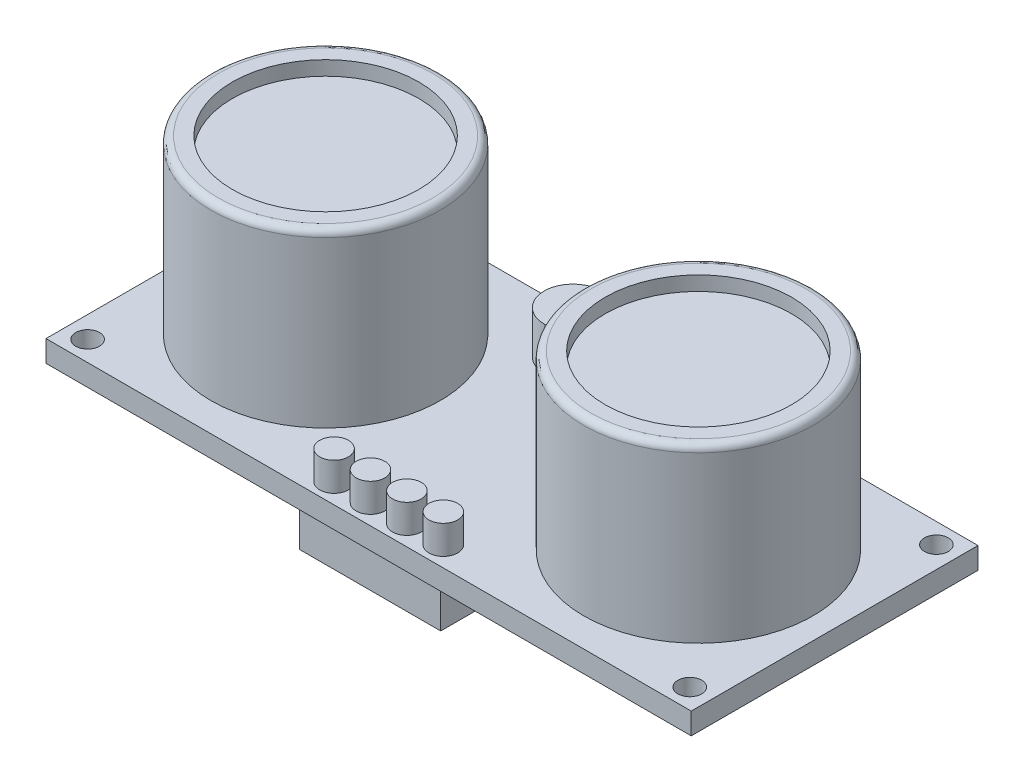
ISO-10303-21;
HEADER;
FILE_DESCRIPTION(('STEP AP214'),'2;1');
FILE_NAME('part.step','',(''),(''),'','','');
FILE_SCHEMA(('AUTOMOTIVE_DESIGN { 1 0 10303 214 1 1 1 1 }'));
ENDSEC;
DATA;
#1=APPLICATION_CONTEXT('core data for automotive mechanical design processes');
#2=APPLICATION_PROTOCOL_DEFINITION('international standard','automotive_design',2000,#1);
#3=PRODUCT_CONTEXT('',#1,'mechanical');
#4=PRODUCT('Part','Part','',(#3));
#5=PRODUCT_RELATED_PRODUCT_CATEGORY('part','',(#4));
#6=PRODUCT_DEFINITION_FORMATION('','',#4);
#7=PRODUCT_DEFINITION_CONTEXT('part definition',#1,'design');
#8=PRODUCT_DEFINITION('design','',#6,#7);
#9=PRODUCT_DEFINITION_SHAPE('','',#8);
#10=(LENGTH_UNIT() NAMED_UNIT(*) SI_UNIT(.MILLI.,.METRE.));
#11=(NAMED_UNIT(*) PLANE_ANGLE_UNIT() SI_UNIT($,.RADIAN.));
#12=(NAMED_UNIT(*) SI_UNIT($,.STERADIAN.) SOLID_ANGLE_UNIT());
#13=UNCERTAINTY_MEASURE_WITH_UNIT(LENGTH_MEASURE(1.E-05),#10,'distance_accuracy_value','');
#14=(GEOMETRIC_REPRESENTATION_CONTEXT(3) GLOBAL_UNCERTAINTY_ASSIGNED_CONTEXT((#13)) GLOBAL_UNIT_ASSIGNED_CONTEXT((#10,
#11,#12)) REPRESENTATION_CONTEXT('',''));
#15=CARTESIAN_POINT('',(0.,0.,0.));
#16=DIRECTION('',(0.,0.,1.));
#17=DIRECTION('',(1.,0.,0.));
#18=AXIS2_PLACEMENT_3D('',#15,#16,#17);
#19=CARTESIAN_POINT('',(0.,0.,0.));
#20=DIRECTION('',(0.,-1.,0.));
#21=DIRECTION('',(0.,0.,-1.));
#22=AXIS2_PLACEMENT_3D('',#19,#20,#21);
#23=PLANE('',#22);
#24=CARTESIAN_POINT('',(21.,0.,-8.6));
#25=DIRECTION('',(0.,-1.,0.));
#26=DIRECTION('',(0.,0.,-1.));
#27=AXIS2_PLACEMENT_3D('',#24,#25,#26);
#28=CIRCLE('',#27,0.83);
#29=CARTESIAN_POINT('',(21.,0.,-9.43));
#30=VERTEX_POINT('',#29);
#31=EDGE_CURVE('E168',#30,#30,#28,.F.);
#32=ORIENTED_EDGE('',*,*,#31,.T.);
#33=EDGE_LOOP('',(#32));
#34=FACE_BOUND('',#33,.T.);
#35=CARTESIAN_POINT('',(21.,0.,8.59999999999999));
#36=DIRECTION('',(0.,-1.,0.));
#37=DIRECTION('',(0.,0.,-1.));
#38=AXIS2_PLACEMENT_3D('',#35,#36,#37);
#39=CIRCLE('',#38,0.83);
#40=CARTESIAN_POINT('',(21.,0.,7.76999999999999));
#41=VERTEX_POINT('',#40);
#42=EDGE_CURVE('E182',#41,#41,#39,.F.);
#43=ORIENTED_EDGE('',*,*,#42,.T.);
#44=EDGE_LOOP('',(#43));
#45=FACE_BOUND('',#44,.T.);
#46=CARTESIAN_POINT('',(-21.,0.,8.6));
#47=DIRECTION('',(0.,-1.,0.));
#48=DIRECTION('',(0.,0.,-1.));
#49=AXIS2_PLACEMENT_3D('',#46,#47,#48);
#50=CIRCLE('',#49,0.83);
#51=CARTESIAN_POINT('',(-21.,0.,7.77));
#52=VERTEX_POINT('',#51);
#53=EDGE_CURVE('E173',#52,#52,#50,.F.);
#54=ORIENTED_EDGE('',*,*,#53,.T.);
#55=EDGE_LOOP('',(#54));
#56=FACE_BOUND('',#55,.T.);
#57=CARTESIAN_POINT('',(-21.,0.,-8.6));
#58=DIRECTION('',(0.,-1.,0.));
#59=DIRECTION('',(0.,0.,-1.));
#60=AXIS2_PLACEMENT_3D('',#57,#58,#59);
#61=CIRCLE('',#60,0.83);
#62=CARTESIAN_POINT('',(-21.,0.,-9.43));
#63=VERTEX_POINT('',#62);
#64=EDGE_CURVE('E177',#63,#63,#61,.F.);
#65=ORIENTED_EDGE('',*,*,#64,.T.);
#66=EDGE_LOOP('',(#65));
#67=FACE_BOUND('',#66,.T.);
#68=DIRECTION('',(0.,0.,1.));
#69=VECTOR('',#68,1.);
#70=CARTESIAN_POINT('',(-22.5,0.,10.));
#71=LINE('',#70,#69);
#72=CARTESIAN_POINT('',(-22.5,0.,-10.));
#73=VERTEX_POINT('',#72);
#74=CARTESIAN_POINT('',(-22.5,0.,10.));
#75=VERTEX_POINT('',#74);
#76=EDGE_CURVE('E274',#73,#75,#71,.T.);
#77=ORIENTED_EDGE('',*,*,#76,.F.);
#78=DIRECTION('',(-1.,0.,0.));
#79=VECTOR('',#78,1.);
#80=CARTESIAN_POINT('',(-22.5,0.,-10.));
#81=LINE('',#80,#79);
#82=CARTESIAN_POINT('',(22.5,0.,-10.));
#83=VERTEX_POINT('',#82);
#84=EDGE_CURVE('E280',#83,#73,#81,.T.);
#85=ORIENTED_EDGE('',*,*,#84,.F.);
#86=DIRECTION('',(0.,0.,-1.));
#87=VECTOR('',#86,1.);
#88=CARTESIAN_POINT('',(22.5,0.,10.));
#89=LINE('',#88,#87);
#90=CARTESIAN_POINT('',(22.5,0.,10.));
#91=VERTEX_POINT('',#90);
#92=EDGE_CURVE('E296',#91,#83,#89,.T.);
#93=ORIENTED_EDGE('',*,*,#92,.F.);
#94=DIRECTION('',(1.,0.,0.));
#95=VECTOR('',#94,1.);
#96=CARTESIAN_POINT('',(-22.5,0.,10.));
#97=LINE('',#96,#95);
#98=EDGE_CURVE('E293',#75,#91,#97,.T.);
#99=ORIENTED_EDGE('',*,*,#98,.F.);
#100=EDGE_LOOP('',(#77,#85,#93,#99));
#101=FACE_BOUND('',#100,.T.);
#102=DIRECTION('',(1.,0.,0.));
#103=VECTOR('',#102,1.);
#104=CARTESIAN_POINT('',(-4.92926342420376,0.,7.26045894058766));
#105=LINE('',#104,#103);
#106=CARTESIAN_POINT('',(-4.92926342420376,0.,7.26045894058766));
#107=VERTEX_POINT('',#106);
#108=CARTESIAN_POINT('',(4.92926342420376,0.,7.26045894058766));
#109=VERTEX_POINT('',#108);
#110=EDGE_CURVE('E868',#107,#109,#105,.T.);
#111=ORIENTED_EDGE('',*,*,#110,.F.);
#112=DIRECTION('',(0.,0.,-1.));
#113=VECTOR('',#112,1.);
#114=CARTESIAN_POINT('',(-4.92926342420376,0.,7.26045894058766));
#115=LINE('',#114,#113);
#116=CARTESIAN_POINT('',(-4.92926342420376,0.,9.9));
#117=VERTEX_POINT('',#116);
#118=EDGE_CURVE('E160',#117,#107,#115,.T.);
#119=ORIENTED_EDGE('',*,*,#118,.F.);
#120=DIRECTION('',(-1.,0.,0.));
#121=VECTOR('',#120,1.);
#122=CARTESIAN_POINT('',(-4.92926342420376,0.,9.9));
#123=LINE('',#122,#121);
#124=CARTESIAN_POINT('',(4.92926342420376,0.,9.9));
#125=VERTEX_POINT('',#124);
#126=EDGE_CURVE('E156',#125,#117,#123,.T.);
#127=ORIENTED_EDGE('',*,*,#126,.F.);
#128=DIRECTION('',(0.,0.,1.));
#129=VECTOR('',#128,1.);
#130=CARTESIAN_POINT('',(4.92926342420376,0.,7.26045894058766));
#131=LINE('',#130,#129);
#132=EDGE_CURVE('E864',#109,#125,#131,.T.);
#133=ORIENTED_EDGE('',*,*,#132,.F.);
#134=EDGE_LOOP('',(#111,#119,#127,#133));
#135=FACE_BOUND('',#134,.T.);
#136=ADVANCED_FACE('F45',(#34,#45,#56,#67,#101,#135),#23,.T.);
#137=CARTESIAN_POINT('',(0.,1.5,0.));
#138=DIRECTION('',(0.,-1.,0.));
#139=DIRECTION('',(0.,0.,-1.));
#140=AXIS2_PLACEMENT_3D('',#137,#138,#139);
#141=PLANE('',#140);
#142=CARTESIAN_POINT('',(21.,1.5,-8.6));
#143=DIRECTION('',(0.,1.,0.));
#144=DIRECTION('',(0.,0.,1.));
#145=AXIS2_PLACEMENT_3D('',#142,#143,#144);
#146=CIRCLE('',#145,0.83);
#147=CARTESIAN_POINT('',(21.,1.5,-7.77));
#148=VERTEX_POINT('',#147);
#149=EDGE_CURVE('E163',#148,#148,#146,.T.);
#150=ORIENTED_EDGE('',*,*,#149,.F.);
#151=EDGE_LOOP('',(#150));
#152=FACE_BOUND('',#151,.T.);
#153=CARTESIAN_POINT('',(21.,1.5,8.59999999999999));
#154=DIRECTION('',(0.,1.,0.));
#155=DIRECTION('',(0.,0.,1.));
#156=AXIS2_PLACEMENT_3D('',#153,#154,#155);
#157=CIRCLE('',#156,0.83);
#158=CARTESIAN_POINT('',(21.,1.5,9.42999999999999));
#159=VERTEX_POINT('',#158);
#160=EDGE_CURVE('E186',#159,#159,#157,.T.);
#161=ORIENTED_EDGE('',*,*,#160,.F.);
#162=EDGE_LOOP('',(#161));
#163=FACE_BOUND('',#162,.T.);
#164=CARTESIAN_POINT('',(-21.,1.5,8.6));
#165=DIRECTION('',(0.,1.,0.));
#166=DIRECTION('',(0.,0.,1.));
#167=AXIS2_PLACEMENT_3D('',#164,#165,#166);
#168=CIRCLE('',#167,0.83);
#169=CARTESIAN_POINT('',(-21.,1.5,9.43));
#170=VERTEX_POINT('',#169);
#171=EDGE_CURVE('E178',#170,#170,#168,.T.);
#172=ORIENTED_EDGE('',*,*,#171,.F.);
#173=EDGE_LOOP('',(#172));
#174=FACE_BOUND('',#173,.T.);
#175=CARTESIAN_POINT('',(-21.,1.5,-8.6));
#176=DIRECTION('',(0.,1.,0.));
#177=DIRECTION('',(0.,0.,1.));
#178=AXIS2_PLACEMENT_3D('',#175,#176,#177);
#179=CIRCLE('',#178,0.83);
#180=CARTESIAN_POINT('',(-21.,1.5,-7.77));
#181=VERTEX_POINT('',#180);
#182=EDGE_CURVE('E193',#181,#181,#179,.T.);
#183=ORIENTED_EDGE('',*,*,#182,.F.);
#184=EDGE_LOOP('',(#183));
#185=FACE_BOUND('',#184,.T.);
#186=CARTESIAN_POINT('',(3.81,1.5,8.6));
#187=DIRECTION('',(0.,-1.,0.));
#188=DIRECTION('',(0.,0.,-1.));
#189=AXIS2_PLACEMENT_3D('',#186,#187,#188);
#190=CIRCLE('',#189,1.);
#191=CARTESIAN_POINT('',(3.81,1.5,7.6));
#192=VERTEX_POINT('',#191);
#193=EDGE_CURVE('E336',#192,#192,#190,.F.);
#194=ORIENTED_EDGE('',*,*,#193,.F.);
#195=EDGE_LOOP('',(#194));
#196=FACE_BOUND('',#195,.T.);
#197=CARTESIAN_POINT('',(1.27,1.5,8.6));
#198=DIRECTION('',(0.,-1.,0.));
#199=DIRECTION('',(0.,0.,-1.));
#200=AXIS2_PLACEMENT_3D('',#197,#198,#199);
#201=CIRCLE('',#200,1.);
#202=CARTESIAN_POINT('',(1.27,1.5,7.6));
#203=VERTEX_POINT('',#202);
#204=EDGE_CURVE('E332',#203,#203,#201,.F.);
#205=ORIENTED_EDGE('',*,*,#204,.F.);
#206=EDGE_LOOP('',(#205));
#207=FACE_BOUND('',#206,.T.);
#208=CARTESIAN_POINT('',(-1.27,1.5,8.6));
#209=DIRECTION('',(0.,-1.,0.));
#210=DIRECTION('',(0.,0.,-1.));
#211=AXIS2_PLACEMENT_3D('',#208,#209,#210);
#212=CIRCLE('',#211,1.);
#213=CARTESIAN_POINT('',(-1.27,1.5,7.6));
#214=VERTEX_POINT('',#213);
#215=EDGE_CURVE('E328',#214,#214,#212,.F.);
#216=ORIENTED_EDGE('',*,*,#215,.F.);
#217=EDGE_LOOP('',(#216));
#218=FACE_BOUND('',#217,.T.);
#219=CARTESIAN_POINT('',(-3.81,1.5,8.6));
#220=DIRECTION('',(0.,-1.,0.));
#221=DIRECTION('',(0.,0.,-1.));
#222=AXIS2_PLACEMENT_3D('',#219,#220,#221);
#223=CIRCLE('',#222,1.);
#224=CARTESIAN_POINT('',(-3.81,1.5,7.6));
#225=VERTEX_POINT('',#224);
#226=EDGE_CURVE('E324',#225,#225,#223,.F.);
#227=ORIENTED_EDGE('',*,*,#226,.F.);
#228=EDGE_LOOP('',(#227));
#229=FACE_BOUND('',#228,.T.);
#230=CARTESIAN_POINT('',(13.,1.5,0.));
#231=DIRECTION('',(0.,-1.,0.));
#232=DIRECTION('',(0.,0.,-1.));
#233=AXIS2_PLACEMENT_3D('',#230,#231,#232);
#234=CIRCLE('',#233,8.);
#235=CARTESIAN_POINT('',(13.,1.5,-8.00000000000001));
#236=VERTEX_POINT('',#235);
#237=EDGE_CURVE('E320',#236,#236,#234,.F.);
#238=ORIENTED_EDGE('',*,*,#237,.F.);
#239=EDGE_LOOP('',(#238));
#240=FACE_BOUND('',#239,.T.);
#241=CARTESIAN_POINT('',(-13.,1.5,0.));
#242=DIRECTION('',(0.,-1.,0.));
#243=DIRECTION('',(0.,0.,-1.));
#244=AXIS2_PLACEMENT_3D('',#241,#242,#243);
#245=CIRCLE('',#244,8.);
#246=CARTESIAN_POINT('',(-13.,1.5,-8.));
#247=VERTEX_POINT('',#246);
#248=EDGE_CURVE('E316',#247,#247,#245,.F.);
#249=ORIENTED_EDGE('',*,*,#248,.F.);
#250=EDGE_LOOP('',(#249));
#251=FACE_BOUND('',#250,.T.);
#252=DIRECTION('',(0.,0.,1.));
#253=VECTOR('',#252,1.);
#254=CARTESIAN_POINT('',(-22.5,1.5,10.));
#255=LINE('',#254,#253);
#256=CARTESIAN_POINT('',(-22.5,1.5,-10.));
#257=VERTEX_POINT('',#256);
#258=CARTESIAN_POINT('',(-22.5,1.5,10.));
#259=VERTEX_POINT('',#258);
#260=EDGE_CURVE('E275',#257,#259,#255,.T.);
#261=ORIENTED_EDGE('',*,*,#260,.T.);
#262=DIRECTION('',(1.,0.,0.));
#263=VECTOR('',#262,1.);
#264=CARTESIAN_POINT('',(-22.5,1.5,10.));
#265=LINE('',#264,#263);
#266=CARTESIAN_POINT('',(22.5,1.5,10.));
#267=VERTEX_POINT('',#266);
#268=EDGE_CURVE('E279',#259,#267,#265,.T.);
#269=ORIENTED_EDGE('',*,*,#268,.T.);
#270=DIRECTION('',(0.,0.,-1.));
#271=VECTOR('',#270,1.);
#272=CARTESIAN_POINT('',(22.5,1.5,10.));
#273=LINE('',#272,#271);
#274=CARTESIAN_POINT('',(22.5,1.5,-10.));
#275=VERTEX_POINT('',#274);
#276=EDGE_CURVE('E283',#267,#275,#273,.T.);
#277=ORIENTED_EDGE('',*,*,#276,.T.);
#278=DIRECTION('',(-1.,0.,0.));
#279=VECTOR('',#278,1.);
#280=CARTESIAN_POINT('',(-22.5,1.5,-10.));
#281=LINE('',#280,#279);
#282=EDGE_CURVE('E286',#275,#257,#281,.T.);
#283=ORIENTED_EDGE('',*,*,#282,.T.);
#284=EDGE_LOOP('',(#261,#269,#277,#283));
#285=FACE_BOUND('',#284,.T.);
#286=CARTESIAN_POINT('',(-3.,1.5,-7.25));
#287=DIRECTION('',(0.,1.,0.));
#288=DIRECTION('',(0.,0.,1.));
#289=AXIS2_PLACEMENT_3D('',#286,#287,#288);
#290=CIRCLE('',#289,2.);
#291=CARTESIAN_POINT('',(-3.,1.5,-9.25));
#292=VERTEX_POINT('',#291);
#293=CARTESIAN_POINT('',(-3.,1.5,-5.25));
#294=VERTEX_POINT('',#293);
#295=EDGE_CURVE('E221',#292,#294,#290,.T.);
#296=ORIENTED_EDGE('',*,*,#295,.F.);
#297=DIRECTION('',(-1.,0.,0.));
#298=VECTOR('',#297,1.);
#299=CARTESIAN_POINT('',(-3.,1.5,-9.25));
#300=LINE('',#299,#298);
#301=CARTESIAN_POINT('',(3.,1.5,-9.25));
#302=VERTEX_POINT('',#301);
#303=EDGE_CURVE('E238',#302,#292,#300,.T.);
#304=ORIENTED_EDGE('',*,*,#303,.F.);
#305=CARTESIAN_POINT('',(3.,1.5,-7.25));
#306=DIRECTION('',(0.,1.,0.));
#307=DIRECTION('',(0.,0.,1.));
#308=AXIS2_PLACEMENT_3D('',#305,#306,#307);
#309=CIRCLE('',#308,2.);
#310=CARTESIAN_POINT('',(3.,1.5,-5.25));
#311=VERTEX_POINT('',#310);
#312=EDGE_CURVE('E253',#311,#302,#309,.T.);
#313=ORIENTED_EDGE('',*,*,#312,.F.);
#314=DIRECTION('',(1.,0.,0.));
#315=VECTOR('',#314,1.);
#316=CARTESIAN_POINT('',(-3.,1.5,-5.25));
#317=LINE('',#316,#315);
#318=EDGE_CURVE('E69',#294,#311,#317,.T.);
#319=ORIENTED_EDGE('',*,*,#318,.F.);
#320=EDGE_LOOP('',(#296,#304,#313,#319));
#321=FACE_BOUND('',#320,.T.);
#322=ADVANCED_FACE('F369',(#152,#163,#174,#185,#196,#207,#218,#229,#240,#251,#285,#321),#141,.F.);
#323=CARTESIAN_POINT('',(-22.5,1.5,10.));
#324=DIRECTION('',(1.,0.,0.));
#325=DIRECTION('',(0.,0.,-1.));
#326=AXIS2_PLACEMENT_3D('',#323,#324,#325);
#327=PLANE('',#326);
#328=ORIENTED_EDGE('',*,*,#76,.T.);
#329=DIRECTION('',(0.,-1.,0.));
#330=VECTOR('',#329,1.);
#331=CARTESIAN_POINT('',(-22.5,1.5,10.));
#332=LINE('',#331,#330);
#333=EDGE_CURVE('E312',#259,#75,#332,.T.);
#334=ORIENTED_EDGE('',*,*,#333,.F.);
#335=ORIENTED_EDGE('',*,*,#260,.F.);
#336=DIRECTION('',(0.,-1.,0.));
#337=VECTOR('',#336,1.);
#338=CARTESIAN_POINT('',(-22.5,1.5,-10.));
#339=LINE('',#338,#337);
#340=EDGE_CURVE('E289',#257,#73,#339,.T.);
#341=ORIENTED_EDGE('',*,*,#340,.T.);
#342=EDGE_LOOP('',(#328,#334,#335,#341));
#343=FACE_BOUND('',#342,.T.);
#344=ADVANCED_FACE('F377',(#343),#327,.F.);
#345=CARTESIAN_POINT('',(-22.5,1.5,10.));
#346=DIRECTION('',(0.,0.,-1.));
#347=DIRECTION('',(-1.,0.,0.));
#348=AXIS2_PLACEMENT_3D('',#345,#346,#347);
#349=PLANE('',#348);
#350=ORIENTED_EDGE('',*,*,#98,.T.);
#351=DIRECTION('',(0.,-1.,0.));
#352=VECTOR('',#351,1.);
#353=CARTESIAN_POINT('',(22.5,1.5,10.));
#354=LINE('',#353,#352);
#355=EDGE_CURVE('E308',#267,#91,#354,.T.);
#356=ORIENTED_EDGE('',*,*,#355,.F.);
#357=ORIENTED_EDGE('',*,*,#268,.F.);
#358=ORIENTED_EDGE('',*,*,#333,.T.);
#359=EDGE_LOOP('',(#350,#356,#357,#358));
#360=FACE_BOUND('',#359,.T.);
#361=ADVANCED_FACE('F391',(#360),#349,.F.);
#362=CARTESIAN_POINT('',(22.5,1.5,10.));
#363=DIRECTION('',(-1.,0.,0.));
#364=DIRECTION('',(0.,0.,1.));
#365=AXIS2_PLACEMENT_3D('',#362,#363,#364);
#366=PLANE('',#365);
#367=ORIENTED_EDGE('',*,*,#92,.T.);
#368=DIRECTION('',(0.,-1.,0.));
#369=VECTOR('',#368,1.);
#370=CARTESIAN_POINT('',(22.5,1.5,-10.));
#371=LINE('',#370,#369);
#372=EDGE_CURVE('E304',#275,#83,#371,.T.);
#373=ORIENTED_EDGE('',*,*,#372,.F.);
#374=ORIENTED_EDGE('',*,*,#276,.F.);
#375=ORIENTED_EDGE('',*,*,#355,.T.);
#376=EDGE_LOOP('',(#367,#373,#374,#375));
#377=FACE_BOUND('',#376,.T.);
#378=ADVANCED_FACE('F387',(#377),#366,.F.);
#379=CARTESIAN_POINT('',(-22.5,1.5,-10.));
#380=DIRECTION('',(0.,0.,1.));
#381=DIRECTION('',(1.,0.,0.));
#382=AXIS2_PLACEMENT_3D('',#379,#380,#381);
#383=PLANE('',#382);
#384=ORIENTED_EDGE('',*,*,#84,.T.);
#385=ORIENTED_EDGE('',*,*,#340,.F.);
#386=ORIENTED_EDGE('',*,*,#282,.F.);
#387=ORIENTED_EDGE('',*,*,#372,.T.);
#388=EDGE_LOOP('',(#384,#385,#386,#387));
#389=FACE_BOUND('',#388,.T.);
#390=ADVANCED_FACE('F383',(#389),#383,.F.);
#391=CARTESIAN_POINT('',(-3.,4.5,-7.25));
#392=DIRECTION('',(0.,-1.,0.));
#393=DIRECTION('',(0.,0.,-1.));
#394=AXIS2_PLACEMENT_3D('',#391,#392,#393);
#395=CYLINDRICAL_SURFACE('',#394,2.);
#396=ORIENTED_EDGE('',*,*,#295,.T.);
#397=DIRECTION('',(0.,-1.,0.));
#398=VECTOR('',#397,1.);
#399=CARTESIAN_POINT('',(-3.,4.5,-5.25));
#400=LINE('',#399,#398);
#401=CARTESIAN_POINT('',(-3.,4.5,-5.25));
#402=VERTEX_POINT('',#401);
#403=EDGE_CURVE('E271',#402,#294,#400,.T.);
#404=ORIENTED_EDGE('',*,*,#403,.F.);
#405=CARTESIAN_POINT('',(-3.,4.5,-7.25));
#406=DIRECTION('',(0.,1.,0.));
#407=DIRECTION('',(0.,0.,1.));
#408=AXIS2_PLACEMENT_3D('',#405,#406,#407);
#409=CIRCLE('',#408,2.);
#410=CARTESIAN_POINT('',(-3.,4.5,-9.25));
#411=VERTEX_POINT('',#410);
#412=EDGE_CURVE('E233',#411,#402,#409,.T.);
#413=ORIENTED_EDGE('',*,*,#412,.F.);
#414=DIRECTION('',(0.,-1.,0.));
#415=VECTOR('',#414,1.);
#416=CARTESIAN_POINT('',(-3.,4.5,-9.25));
#417=LINE('',#416,#415);
#418=EDGE_CURVE('E247',#411,#292,#417,.T.);
#419=ORIENTED_EDGE('',*,*,#418,.T.);
#420=EDGE_LOOP('',(#396,#404,#413,#419));
#421=FACE_BOUND('',#420,.T.);
#422=ADVANCED_FACE('F386',(#421),#395,.T.);
#423=CARTESIAN_POINT('',(-3.,4.5,-5.25));
#424=DIRECTION('',(0.,0.,-1.));
#425=DIRECTION('',(-1.,0.,0.));
#426=AXIS2_PLACEMENT_3D('',#423,#424,#425);
#427=PLANE('',#426);
#428=ORIENTED_EDGE('',*,*,#318,.T.);
#429=DIRECTION('',(0.,-1.,0.));
#430=VECTOR('',#429,1.);
#431=CARTESIAN_POINT('',(3.,4.5,-5.25));
#432=LINE('',#431,#430);
#433=CARTESIAN_POINT('',(3.,4.5,-5.25));
#434=VERTEX_POINT('',#433);
#435=EDGE_CURVE('E267',#434,#311,#432,.T.);
#436=ORIENTED_EDGE('',*,*,#435,.F.);
#437=DIRECTION('',(1.,0.,0.));
#438=VECTOR('',#437,1.);
#439=CARTESIAN_POINT('',(-3.,4.5,-5.25));
#440=LINE('',#439,#438);
#441=EDGE_CURVE('E237',#402,#434,#440,.T.);
#442=ORIENTED_EDGE('',*,*,#441,.F.);
#443=ORIENTED_EDGE('',*,*,#403,.T.);
#444=EDGE_LOOP('',(#428,#436,#442,#443));
#445=FACE_BOUND('',#444,.T.);
#446=ADVANCED_FACE('F428',(#445),#427,.F.);
#447=CARTESIAN_POINT('',(3.,4.5,-7.25));
#448=DIRECTION('',(0.,-1.,0.));
#449=DIRECTION('',(0.,0.,-1.));
#450=AXIS2_PLACEMENT_3D('',#447,#448,#449);
#451=CYLINDRICAL_SURFACE('',#450,2.);
#452=ORIENTED_EDGE('',*,*,#312,.T.);
#453=DIRECTION('',(0.,-1.,0.));
#454=VECTOR('',#453,1.);
#455=CARTESIAN_POINT('',(3.,4.5,-9.25000000000001));
#456=LINE('',#455,#454);
#457=CARTESIAN_POINT('',(3.,4.5,-9.25000000000001));
#458=VERTEX_POINT('',#457);
#459=EDGE_CURVE('E263',#458,#302,#456,.T.);
#460=ORIENTED_EDGE('',*,*,#459,.F.);
#461=CARTESIAN_POINT('',(3.,4.5,-7.25));
#462=DIRECTION('',(0.,1.,0.));
#463=DIRECTION('',(0.,0.,1.));
#464=AXIS2_PLACEMENT_3D('',#461,#462,#463);
#465=CIRCLE('',#464,2.);
#466=EDGE_CURVE('E241',#434,#458,#465,.T.);
#467=ORIENTED_EDGE('',*,*,#466,.F.);
#468=ORIENTED_EDGE('',*,*,#435,.T.);
#469=EDGE_LOOP('',(#452,#460,#467,#468));
#470=FACE_BOUND('',#469,.T.);
#471=ADVANCED_FACE('F426',(#470),#451,.T.);
#472=CARTESIAN_POINT('',(-3.,4.5,-9.25));
#473=DIRECTION('',(0.,0.,1.));
#474=DIRECTION('',(1.,0.,0.));
#475=AXIS2_PLACEMENT_3D('',#472,#473,#474);
#476=PLANE('',#475);
#477=ORIENTED_EDGE('',*,*,#303,.T.);
#478=ORIENTED_EDGE('',*,*,#418,.F.);
#479=DIRECTION('',(-1.,0.,0.));
#480=VECTOR('',#479,1.);
#481=CARTESIAN_POINT('',(-3.,4.5,-9.25));
#482=LINE('',#481,#480);
#483=EDGE_CURVE('E244',#458,#411,#482,.T.);
#484=ORIENTED_EDGE('',*,*,#483,.F.);
#485=ORIENTED_EDGE('',*,*,#459,.T.);
#486=EDGE_LOOP('',(#477,#478,#484,#485));
#487=FACE_BOUND('',#486,.T.);
#488=ADVANCED_FACE('F417',(#487),#476,.F.);
#489=CARTESIAN_POINT('',(-3.,4.5,-7.25));
#490=DIRECTION('',(0.,1.,0.));
#491=DIRECTION('',(0.,0.,1.));
#492=AXIS2_PLACEMENT_3D('',#489,#490,#491);
#493=PLANE('',#492);
#494=ORIENTED_EDGE('',*,*,#412,.T.);
#495=ORIENTED_EDGE('',*,*,#441,.T.);
#496=ORIENTED_EDGE('',*,*,#466,.T.);
#497=ORIENTED_EDGE('',*,*,#483,.T.);
#498=EDGE_LOOP('',(#494,#495,#496,#497));
#499=FACE_BOUND('',#498,.T.);
#500=ADVANCED_FACE('F422',(#499),#493,.T.);
#501=CARTESIAN_POINT('',(-13.,13.5,0.));
#502=DIRECTION('',(0.,-1.,0.));
#503=DIRECTION('',(0.,0.,-1.));
#504=AXIS2_PLACEMENT_3D('',#501,#502,#503);
#505=CYLINDRICAL_SURFACE('',#504,8.);
#506=CARTESIAN_POINT('',(-13.,13.,0.));
#507=DIRECTION('',(0.,1.,0.));
#508=DIRECTION('',(0.,0.,1.));
#509=AXIS2_PLACEMENT_3D('',#506,#507,#508);
#510=CIRCLE('',#509,8.);
#511=CARTESIAN_POINT('',(-13.,13.,8.));
#512=VERTEX_POINT('',#511);
#513=EDGE_CURVE('E11',#512,#512,#510,.F.);
#514=ORIENTED_EDGE('',*,*,#513,.T.);
#515=EDGE_LOOP('',(#514));
#516=FACE_BOUND('',#515,.T.);
#517=ORIENTED_EDGE('',*,*,#248,.T.);
#518=EDGE_LOOP('',(#517));
#519=FACE_BOUND('',#518,.T.);
#520=ADVANCED_FACE('F441',(#516,#519),#505,.T.);
#521=CARTESIAN_POINT('',(-13.,13.5,0.));
#522=DIRECTION('',(0.,1.,0.));
#523=DIRECTION('',(0.,0.,1.));
#524=AXIS2_PLACEMENT_3D('',#521,#522,#523);
#525=PLANE('',#524);
#526=CARTESIAN_POINT('',(-13.,13.5,0.));
#527=DIRECTION('',(0.,1.,0.));
#528=DIRECTION('',(0.,0.,1.));
#529=AXIS2_PLACEMENT_3D('',#526,#527,#528);
#530=CIRCLE('',#529,7.5);
#531=CARTESIAN_POINT('',(-13.,13.5,7.5));
#532=VERTEX_POINT('',#531);
#533=EDGE_CURVE('E54',#532,#532,#530,.T.);
#534=ORIENTED_EDGE('',*,*,#533,.T.);
#535=EDGE_LOOP('',(#534));
#536=FACE_BOUND('',#535,.T.);
#537=CARTESIAN_POINT('',(-13.,13.5,0.));
#538=DIRECTION('',(0.,1.,0.));
#539=DIRECTION('',(0.,0.,1.));
#540=AXIS2_PLACEMENT_3D('',#537,#538,#539);
#541=CIRCLE('',#540,6.5);
#542=CARTESIAN_POINT('',(-13.,13.5,6.5));
#543=VERTEX_POINT('',#542);
#544=EDGE_CURVE('E222',#543,#543,#541,.T.);
#545=ORIENTED_EDGE('',*,*,#544,.F.);
#546=EDGE_LOOP('',(#545));
#547=FACE_BOUND('',#546,.T.);
#548=ADVANCED_FACE('F351',(#536,#547),#525,.T.);
#549=CARTESIAN_POINT('',(13.,13.5,0.));
#550=DIRECTION('',(0.,-1.,0.));
#551=DIRECTION('',(0.,0.,-1.));
#552=AXIS2_PLACEMENT_3D('',#549,#550,#551);
#553=CYLINDRICAL_SURFACE('',#552,8.);
#554=CARTESIAN_POINT('',(13.,13.,0.));
#555=DIRECTION('',(0.,1.,0.));
#556=DIRECTION('',(0.,0.,1.));
#557=AXIS2_PLACEMENT_3D('',#554,#555,#556);
#558=CIRCLE('',#557,8.);
#559=CARTESIAN_POINT('',(13.,13.,8.));
#560=VERTEX_POINT('',#559);
#561=EDGE_CURVE('E344',#560,#560,#558,.F.);
#562=ORIENTED_EDGE('',*,*,#561,.T.);
#563=EDGE_LOOP('',(#562));
#564=FACE_BOUND('',#563,.T.);
#565=ORIENTED_EDGE('',*,*,#237,.T.);
#566=EDGE_LOOP('',(#565));
#567=FACE_BOUND('',#566,.T.);
#568=ADVANCED_FACE('F447',(#564,#567),#553,.T.);
#569=CARTESIAN_POINT('',(13.,13.5,0.));
#570=DIRECTION('',(0.,1.,0.));
#571=DIRECTION('',(0.,0.,1.));
#572=AXIS2_PLACEMENT_3D('',#569,#570,#571);
#573=PLANE('',#572);
#574=CARTESIAN_POINT('',(13.,13.5,0.));
#575=DIRECTION('',(0.,1.,0.));
#576=DIRECTION('',(0.,0.,1.));
#577=AXIS2_PLACEMENT_3D('',#574,#575,#576);
#578=CIRCLE('',#577,7.5);
#579=CARTESIAN_POINT('',(13.,13.5,7.5));
#580=VERTEX_POINT('',#579);
#581=EDGE_CURVE('E340',#580,#580,#578,.T.);
#582=ORIENTED_EDGE('',*,*,#581,.T.);
#583=EDGE_LOOP('',(#582));
#584=FACE_BOUND('',#583,.T.);
#585=CARTESIAN_POINT('',(13.,13.5,0.));
#586=DIRECTION('',(0.,1.,0.));
#587=DIRECTION('',(0.,0.,1.));
#588=AXIS2_PLACEMENT_3D('',#585,#586,#587);
#589=CIRCLE('',#588,6.5);
#590=CARTESIAN_POINT('',(13.,13.5,6.5));
#591=VERTEX_POINT('',#590);
#592=EDGE_CURVE('E226',#591,#591,#589,.T.);
#593=ORIENTED_EDGE('',*,*,#592,.F.);
#594=EDGE_LOOP('',(#593));
#595=FACE_BOUND('',#594,.T.);
#596=ADVANCED_FACE('F448',(#584,#595),#573,.T.);
#597=CARTESIAN_POINT('',(13.,12.5,0.));
#598=DIRECTION('',(0.,1.,0.));
#599=DIRECTION('',(0.,0.,1.));
#600=AXIS2_PLACEMENT_3D('',#597,#598,#599);
#601=CYLINDRICAL_SURFACE('',#600,6.5);
#602=CARTESIAN_POINT('',(13.,12.5,0.));
#603=DIRECTION('',(0.,1.,0.));
#604=DIRECTION('',(0.,0.,1.));
#605=AXIS2_PLACEMENT_3D('',#602,#603,#604);
#606=CIRCLE('',#605,6.5);
#607=CARTESIAN_POINT('',(13.,12.5,6.5));
#608=VERTEX_POINT('',#607);
#609=EDGE_CURVE('E216',#608,#608,#606,.T.);
#610=ORIENTED_EDGE('',*,*,#609,.F.);
#611=EDGE_LOOP('',(#610));
#612=FACE_BOUND('',#611,.T.);
#613=ORIENTED_EDGE('',*,*,#592,.T.);
#614=EDGE_LOOP('',(#613));
#615=FACE_BOUND('',#614,.T.);
#616=ADVANCED_FACE('F451',(#612,#615),#601,.F.);
#617=CARTESIAN_POINT('',(13.,12.5,0.));
#618=DIRECTION('',(0.,1.,0.));
#619=DIRECTION('',(0.,0.,1.));
#620=AXIS2_PLACEMENT_3D('',#617,#618,#619);
#621=PLANE('',#620);
#622=ORIENTED_EDGE('',*,*,#609,.T.);
#623=EDGE_LOOP('',(#622));
#624=FACE_BOUND('',#623,.T.);
#625=ADVANCED_FACE('F456',(#624),#621,.T.);
#626=CARTESIAN_POINT('',(-13.,12.5,0.));
#627=DIRECTION('',(0.,1.,0.));
#628=DIRECTION('',(0.,0.,1.));
#629=AXIS2_PLACEMENT_3D('',#626,#627,#628);
#630=CYLINDRICAL_SURFACE('',#629,6.5);
#631=CARTESIAN_POINT('',(-13.,12.5,0.));
#632=DIRECTION('',(0.,1.,0.));
#633=DIRECTION('',(0.,0.,1.));
#634=AXIS2_PLACEMENT_3D('',#631,#632,#633);
#635=CIRCLE('',#634,6.5);
#636=CARTESIAN_POINT('',(-13.,12.5,6.5));
#637=VERTEX_POINT('',#636);
#638=EDGE_CURVE('E217',#637,#637,#635,.T.);
#639=ORIENTED_EDGE('',*,*,#638,.F.);
#640=EDGE_LOOP('',(#639));
#641=FACE_BOUND('',#640,.T.);
#642=ORIENTED_EDGE('',*,*,#544,.T.);
#643=EDGE_LOOP('',(#642));
#644=FACE_BOUND('',#643,.T.);
#645=ADVANCED_FACE('F459',(#641,#644),#630,.F.);
#646=CARTESIAN_POINT('',(-13.,12.5,0.));
#647=DIRECTION('',(0.,1.,0.));
#648=DIRECTION('',(0.,0.,1.));
#649=AXIS2_PLACEMENT_3D('',#646,#647,#648);
#650=PLANE('',#649);
#651=ORIENTED_EDGE('',*,*,#638,.T.);
#652=EDGE_LOOP('',(#651));
#653=FACE_BOUND('',#652,.T.);
#654=ADVANCED_FACE('F466',(#653),#650,.T.);
#655=CARTESIAN_POINT('',(-3.81,3.5,8.6));
#656=DIRECTION('',(0.,-1.,0.));
#657=DIRECTION('',(0.,0.,-1.));
#658=AXIS2_PLACEMENT_3D('',#655,#656,#657);
#659=CYLINDRICAL_SURFACE('',#658,1.);
#660=CARTESIAN_POINT('',(-3.81,3.5,8.6));
#661=DIRECTION('',(0.,1.,0.));
#662=DIRECTION('',(0.,0.,1.));
#663=AXIS2_PLACEMENT_3D('',#660,#661,#662);
#664=CIRCLE('',#663,1.);
#665=CARTESIAN_POINT('',(-3.81,3.5,9.6));
#666=VERTEX_POINT('',#665);
#667=EDGE_CURVE('E212',#666,#666,#664,.T.);
#668=ORIENTED_EDGE('',*,*,#667,.F.);
#669=EDGE_LOOP('',(#668));
#670=FACE_BOUND('',#669,.T.);
#671=ORIENTED_EDGE('',*,*,#226,.T.);
#672=EDGE_LOOP('',(#671));
#673=FACE_BOUND('',#672,.T.);
#674=ADVANCED_FACE('F470',(#670,#673),#659,.T.);
#675=CARTESIAN_POINT('',(-3.81,3.5,8.6));
#676=DIRECTION('',(0.,1.,0.));
#677=DIRECTION('',(0.,0.,1.));
#678=AXIS2_PLACEMENT_3D('',#675,#676,#677);
#679=PLANE('',#678);
#680=ORIENTED_EDGE('',*,*,#667,.T.);
#681=EDGE_LOOP('',(#680));
#682=FACE_BOUND('',#681,.T.);
#683=ADVANCED_FACE('F474',(#682),#679,.T.);
#684=CARTESIAN_POINT('',(-1.27,3.5,8.6));
#685=DIRECTION('',(0.,-1.,0.));
#686=DIRECTION('',(0.,0.,-1.));
#687=AXIS2_PLACEMENT_3D('',#684,#685,#686);
#688=CYLINDRICAL_SURFACE('',#687,1.);
#689=CARTESIAN_POINT('',(-1.27,3.5,8.6));
#690=DIRECTION('',(0.,1.,0.));
#691=DIRECTION('',(0.,0.,1.));
#692=AXIS2_PLACEMENT_3D('',#689,#690,#691);
#693=CIRCLE('',#692,1.);
#694=CARTESIAN_POINT('',(-1.27,3.5,9.6));
#695=VERTEX_POINT('',#694);
#696=EDGE_CURVE('E208',#695,#695,#693,.T.);
#697=ORIENTED_EDGE('',*,*,#696,.F.);
#698=EDGE_LOOP('',(#697));
#699=FACE_BOUND('',#698,.T.);
#700=ORIENTED_EDGE('',*,*,#215,.T.);
#701=EDGE_LOOP('',(#700));
#702=FACE_BOUND('',#701,.T.);
#703=ADVANCED_FACE('F478',(#699,#702),#688,.T.);
#704=CARTESIAN_POINT('',(-1.27,3.5,8.6));
#705=DIRECTION('',(0.,1.,0.));
#706=DIRECTION('',(0.,0.,1.));
#707=AXIS2_PLACEMENT_3D('',#704,#705,#706);
#708=PLANE('',#707);
#709=ORIENTED_EDGE('',*,*,#696,.T.);
#710=EDGE_LOOP('',(#709));
#711=FACE_BOUND('',#710,.T.);
#712=ADVANCED_FACE('F480',(#711),#708,.T.);
#713=CARTESIAN_POINT('',(1.27,3.5,8.6));
#714=DIRECTION('',(0.,-1.,0.));
#715=DIRECTION('',(0.,0.,-1.));
#716=AXIS2_PLACEMENT_3D('',#713,#714,#715);
#717=CYLINDRICAL_SURFACE('',#716,1.);
#718=CARTESIAN_POINT('',(1.27,3.5,8.6));
#719=DIRECTION('',(0.,1.,0.));
#720=DIRECTION('',(0.,0.,1.));
#721=AXIS2_PLACEMENT_3D('',#718,#719,#720);
#722=CIRCLE('',#721,1.);
#723=CARTESIAN_POINT('',(1.27,3.5,9.6));
#724=VERTEX_POINT('',#723);
#725=EDGE_CURVE('E204',#724,#724,#722,.T.);
#726=ORIENTED_EDGE('',*,*,#725,.F.);
#727=EDGE_LOOP('',(#726));
#728=FACE_BOUND('',#727,.T.);
#729=ORIENTED_EDGE('',*,*,#204,.T.);
#730=EDGE_LOOP('',(#729));
#731=FACE_BOUND('',#730,.T.);
#732=ADVANCED_FACE('F483',(#728,#731),#717,.T.);
#733=CARTESIAN_POINT('',(1.27,3.5,8.6));
#734=DIRECTION('',(0.,1.,0.));
#735=DIRECTION('',(0.,0.,1.));
#736=AXIS2_PLACEMENT_3D('',#733,#734,#735);
#737=PLANE('',#736);
#738=ORIENTED_EDGE('',*,*,#725,.T.);
#739=EDGE_LOOP('',(#738));
#740=FACE_BOUND('',#739,.T.);
#741=ADVANCED_FACE('F488',(#740),#737,.T.);
#742=CARTESIAN_POINT('',(3.81,3.5,8.6));
#743=DIRECTION('',(0.,-1.,0.));
#744=DIRECTION('',(0.,0.,-1.));
#745=AXIS2_PLACEMENT_3D('',#742,#743,#744);
#746=CYLINDRICAL_SURFACE('',#745,1.);
#747=CARTESIAN_POINT('',(3.81,3.5,8.6));
#748=DIRECTION('',(0.,1.,0.));
#749=DIRECTION('',(0.,0.,1.));
#750=AXIS2_PLACEMENT_3D('',#747,#748,#749);
#751=CIRCLE('',#750,1.);
#752=CARTESIAN_POINT('',(3.81,3.5,9.6));
#753=VERTEX_POINT('',#752);
#754=EDGE_CURVE('E197',#753,#753,#751,.T.);
#755=ORIENTED_EDGE('',*,*,#754,.F.);
#756=EDGE_LOOP('',(#755));
#757=FACE_BOUND('',#756,.T.);
#758=ORIENTED_EDGE('',*,*,#193,.T.);
#759=EDGE_LOOP('',(#758));
#760=FACE_BOUND('',#759,.T.);
#761=ADVANCED_FACE('F491',(#757,#760),#746,.T.);
#762=CARTESIAN_POINT('',(3.81,3.5,8.6));
#763=DIRECTION('',(0.,1.,0.));
#764=DIRECTION('',(0.,0.,1.));
#765=AXIS2_PLACEMENT_3D('',#762,#763,#764);
#766=PLANE('',#765);
#767=ORIENTED_EDGE('',*,*,#754,.T.);
#768=EDGE_LOOP('',(#767));
#769=FACE_BOUND('',#768,.T.);
#770=ADVANCED_FACE('F365',(#769),#766,.T.);
#771=CARTESIAN_POINT('',(13.,13.,0.));
#772=DIRECTION('',(0.,1.,0.));
#773=DIRECTION('',(0.,0.,1.));
#774=AXIS2_PLACEMENT_3D('',#771,#772,#773);
#775=TOROIDAL_SURFACE('',#774,7.5,0.5);
#776=ORIENTED_EDGE('',*,*,#561,.F.);
#777=EDGE_LOOP('',(#776));
#778=FACE_BOUND('',#777,.T.);
#779=ORIENTED_EDGE('',*,*,#581,.F.);
#780=EDGE_LOOP('',(#779));
#781=FACE_BOUND('',#780,.T.);
#782=ADVANCED_FACE('F356',(#778,#781),#775,.T.);
#783=CARTESIAN_POINT('',(-13.,13.,0.));
#784=DIRECTION('',(0.,1.,0.));
#785=DIRECTION('',(0.,0.,1.));
#786=AXIS2_PLACEMENT_3D('',#783,#784,#785);
#787=TOROIDAL_SURFACE('',#786,7.5,0.5);
#788=ORIENTED_EDGE('',*,*,#513,.F.);
#789=EDGE_LOOP('',(#788));
#790=FACE_BOUND('',#789,.T.);
#791=ORIENTED_EDGE('',*,*,#533,.F.);
#792=EDGE_LOOP('',(#791));
#793=FACE_BOUND('',#792,.T.);
#794=ADVANCED_FACE('F47',(#790,#793),#787,.T.);
#795=CARTESIAN_POINT('',(-21.,-0.000999999999999916,-8.6));
#796=DIRECTION('',(0.,1.,0.));
#797=DIRECTION('',(0.,0.,1.));
#798=AXIS2_PLACEMENT_3D('',#795,#796,#797);
#799=CYLINDRICAL_SURFACE('',#798,0.83);
#800=ORIENTED_EDGE('',*,*,#64,.F.);
#801=EDGE_LOOP('',(#800));
#802=FACE_BOUND('',#801,.T.);
#803=ORIENTED_EDGE('',*,*,#182,.T.);
#804=EDGE_LOOP('',(#803));
#805=FACE_BOUND('',#804,.T.);
#806=ADVANCED_FACE('F355',(#802,#805),#799,.F.);
#807=CARTESIAN_POINT('',(-21.,-0.000999999999999916,8.6));
#808=DIRECTION('',(0.,1.,0.));
#809=DIRECTION('',(0.,0.,1.));
#810=AXIS2_PLACEMENT_3D('',#807,#808,#809);
#811=CYLINDRICAL_SURFACE('',#810,0.83);
#812=ORIENTED_EDGE('',*,*,#53,.F.);
#813=EDGE_LOOP('',(#812));
#814=FACE_BOUND('',#813,.T.);
#815=ORIENTED_EDGE('',*,*,#171,.T.);
#816=EDGE_LOOP('',(#815));
#817=FACE_BOUND('',#816,.T.);
#818=ADVANCED_FACE('F362',(#814,#817),#811,.F.);
#819=CARTESIAN_POINT('',(21.,-0.000999999999999916,8.59999999999999));
#820=DIRECTION('',(0.,1.,0.));
#821=DIRECTION('',(0.,0.,1.));
#822=AXIS2_PLACEMENT_3D('',#819,#820,#821);
#823=CYLINDRICAL_SURFACE('',#822,0.83);
#824=ORIENTED_EDGE('',*,*,#42,.F.);
#825=EDGE_LOOP('',(#824));
#826=FACE_BOUND('',#825,.T.);
#827=ORIENTED_EDGE('',*,*,#160,.T.);
#828=EDGE_LOOP('',(#827));
#829=FACE_BOUND('',#828,.T.);
#830=ADVANCED_FACE('F505',(#826,#829),#823,.F.);
#831=CARTESIAN_POINT('',(21.,-0.000999999999999916,-8.6));
#832=DIRECTION('',(0.,1.,0.));
#833=DIRECTION('',(0.,0.,1.));
#834=AXIS2_PLACEMENT_3D('',#831,#832,#833);
#835=CYLINDRICAL_SURFACE('',#834,0.83);
#836=ORIENTED_EDGE('',*,*,#31,.F.);
#837=EDGE_LOOP('',(#836));
#838=FACE_BOUND('',#837,.T.);
#839=ORIENTED_EDGE('',*,*,#149,.T.);
#840=EDGE_LOOP('',(#839));
#841=FACE_BOUND('',#840,.T.);
#842=ADVANCED_FACE('F502',(#838,#841),#835,.F.);
#843=CARTESIAN_POINT('',(-4.92926342420376,-2.5,7.26045894058766));
#844=DIRECTION('',(1.,0.,0.));
#845=DIRECTION('',(0.,0.,-1.));
#846=AXIS2_PLACEMENT_3D('',#843,#844,#845);
#847=PLANE('',#846);
#848=ORIENTED_EDGE('',*,*,#118,.T.);
#849=DIRECTION('',(0.,1.,0.));
#850=VECTOR('',#849,1.);
#851=CARTESIAN_POINT('',(-4.92926342420376,-2.5,7.26045894058766));
#852=LINE('',#851,#850);
#853=CARTESIAN_POINT('',(-4.92926342420376,-2.5,7.26045894058766));
#854=VERTEX_POINT('',#853);
#855=EDGE_CURVE('E139',#854,#107,#852,.T.);
#856=ORIENTED_EDGE('',*,*,#855,.F.);
#857=DIRECTION('',(0.,0.,-1.));
#858=VECTOR('',#857,1.);
#859=CARTESIAN_POINT('',(-4.92926342420376,-2.5,7.26045894058766));
#860=LINE('',#859,#858);
#861=CARTESIAN_POINT('',(-4.92926342420376,-2.5,9.9));
#862=VERTEX_POINT('',#861);
#863=EDGE_CURVE('E147',#862,#854,#860,.T.);
#864=ORIENTED_EDGE('',*,*,#863,.F.);
#865=DIRECTION('',(0.,1.,0.));
#866=VECTOR('',#865,1.);
#867=CARTESIAN_POINT('',(-4.92926342420376,-2.5,9.9));
#868=LINE('',#867,#866);
#869=EDGE_CURVE('E861',#862,#117,#868,.T.);
#870=ORIENTED_EDGE('',*,*,#869,.T.);
#871=EDGE_LOOP('',(#848,#856,#864,#870));
#872=FACE_BOUND('',#871,.T.);
#873=ADVANCED_FACE('F158',(#872),#847,.F.);
#874=CARTESIAN_POINT('',(-4.92926342420376,-2.5,7.26045894058766));
#875=DIRECTION('',(0.,0.,1.));
#876=DIRECTION('',(1.,0.,0.));
#877=AXIS2_PLACEMENT_3D('',#874,#875,#876);
#878=PLANE('',#877);
#879=ORIENTED_EDGE('',*,*,#110,.T.);
#880=DIRECTION('',(0.,1.,0.));
#881=VECTOR('',#880,1.);
#882=CARTESIAN_POINT('',(4.92926342420376,-2.5,7.26045894058766));
#883=LINE('',#882,#881);
#884=CARTESIAN_POINT('',(4.92926342420376,-2.5,7.26045894058766));
#885=VERTEX_POINT('',#884);
#886=EDGE_CURVE('E142',#885,#109,#883,.T.);
#887=ORIENTED_EDGE('',*,*,#886,.F.);
#888=DIRECTION('',(1.,0.,0.));
#889=VECTOR('',#888,1.);
#890=CARTESIAN_POINT('',(-4.92926342420376,-2.5,7.26045894058766));
#891=LINE('',#890,#889);
#892=EDGE_CURVE('E135',#854,#885,#891,.T.);
#893=ORIENTED_EDGE('',*,*,#892,.F.);
#894=ORIENTED_EDGE('',*,*,#855,.T.);
#895=EDGE_LOOP('',(#879,#887,#893,#894));
#896=FACE_BOUND('',#895,.T.);
#897=ADVANCED_FACE('F137',(#896),#878,.F.);
#898=CARTESIAN_POINT('',(4.92926342420376,-2.5,7.26045894058766));
#899=DIRECTION('',(-1.,0.,0.));
#900=DIRECTION('',(0.,0.,1.));
#901=AXIS2_PLACEMENT_3D('',#898,#899,#900);
#902=PLANE('',#901);
#903=ORIENTED_EDGE('',*,*,#132,.T.);
#904=DIRECTION('',(0.,1.,0.));
#905=VECTOR('',#904,1.);
#906=CARTESIAN_POINT('',(4.92926342420376,-2.5,9.9));
#907=LINE('',#906,#905);
#908=CARTESIAN_POINT('',(4.92926342420376,-2.5,9.9));
#909=VERTEX_POINT('',#908);
#910=EDGE_CURVE('E61',#909,#125,#907,.T.);
#911=ORIENTED_EDGE('',*,*,#910,.F.);
#912=DIRECTION('',(0.,0.,1.));
#913=VECTOR('',#912,1.);
#914=CARTESIAN_POINT('',(4.92926342420376,-2.5,7.26045894058766));
#915=LINE('',#914,#913);
#916=EDGE_CURVE('E146',#885,#909,#915,.T.);
#917=ORIENTED_EDGE('',*,*,#916,.F.);
#918=ORIENTED_EDGE('',*,*,#886,.T.);
#919=EDGE_LOOP('',(#903,#911,#917,#918));
#920=FACE_BOUND('',#919,.T.);
#921=ADVANCED_FACE('F517',(#920),#902,.F.);
#922=CARTESIAN_POINT('',(-4.92926342420376,-2.5,9.9));
#923=DIRECTION('',(0.,0.,-1.));
#924=DIRECTION('',(-1.,0.,0.));
#925=AXIS2_PLACEMENT_3D('',#922,#923,#924);
#926=PLANE('',#925);
#927=ORIENTED_EDGE('',*,*,#126,.T.);
#928=ORIENTED_EDGE('',*,*,#869,.F.);
#929=DIRECTION('',(-1.,0.,0.));
#930=VECTOR('',#929,1.);
#931=CARTESIAN_POINT('',(-4.92926342420376,-2.5,9.9));
#932=LINE('',#931,#930);
#933=EDGE_CURVE('E151',#909,#862,#932,.T.);
#934=ORIENTED_EDGE('',*,*,#933,.F.);
#935=ORIENTED_EDGE('',*,*,#910,.T.);
#936=EDGE_LOOP('',(#927,#928,#934,#935));
#937=FACE_BOUND('',#936,.T.);
#938=ADVANCED_FACE('F520',(#937),#926,.F.);
#939=CARTESIAN_POINT('',(0.,-2.5,0.));
#940=DIRECTION('',(0.,1.,0.));
#941=DIRECTION('',(0.,0.,1.));
#942=AXIS2_PLACEMENT_3D('',#939,#940,#941);
#943=PLANE('',#942);
#944=ORIENTED_EDGE('',*,*,#863,.T.);
#945=ORIENTED_EDGE('',*,*,#892,.T.);
#946=ORIENTED_EDGE('',*,*,#916,.T.);
#947=ORIENTED_EDGE('',*,*,#933,.T.);
#948=EDGE_LOOP('',(#944,#945,#946,#947));
#949=FACE_BOUND('',#948,.T.);
#950=ADVANCED_FACE('F150',(#949),#943,.F.);
#951=CLOSED_SHELL('',(#136,#322,#344,#361,#378,#390,#422,#446,#471,#488,#500,#520,#548,#568,
#596,#616,#625,#645,#654,#674,#683,#703,#712,#732,#741,#761,#770,#782,#794,#806,#818,#830,#842,
#873,#897,#921,#938,#950));
#952=MANIFOLD_SOLID_BREP('B2',#951);
#953=ADVANCED_BREP_SHAPE_REPRESENTATION('',(#18,#952),#14);
#954=SHAPE_DEFINITION_REPRESENTATION(#9,#953);
ENDSEC;
END-ISO-10303-21;
